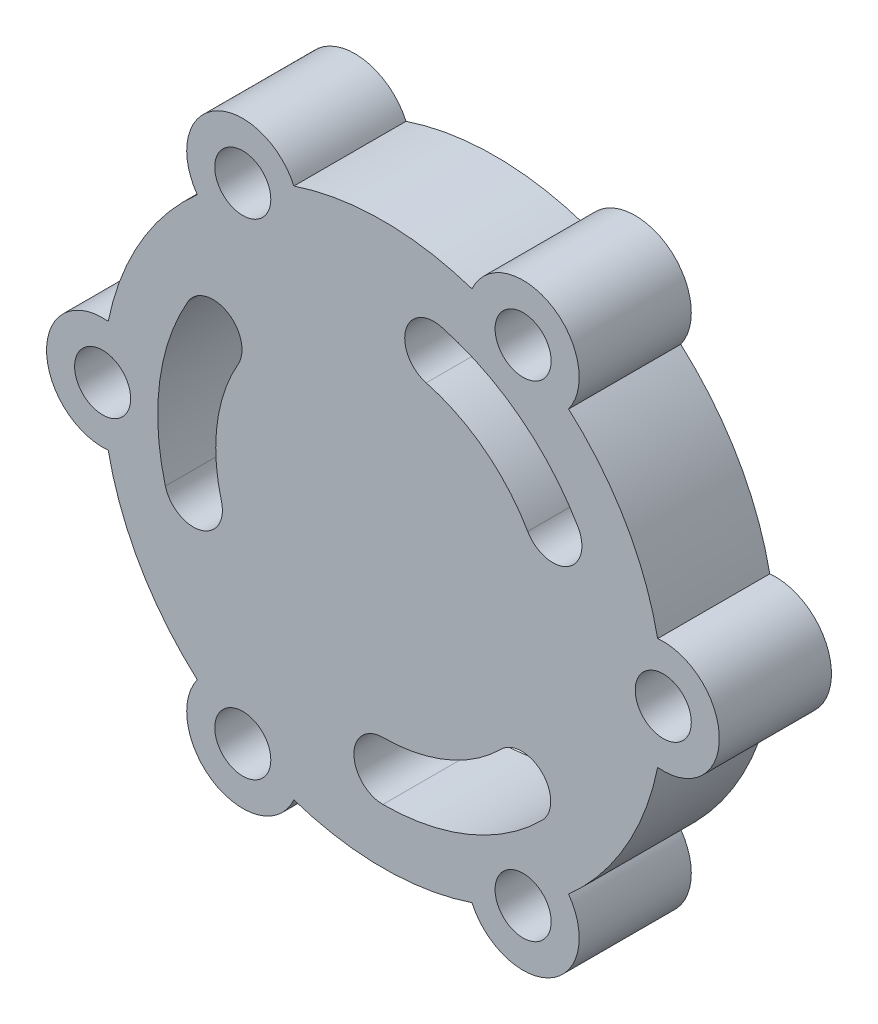
ISO-10303-21;
HEADER;
FILE_DESCRIPTION(('STEP AP214'),'2;1');
FILE_NAME('part.step','',(''),(''),'','','');
FILE_SCHEMA(('AUTOMOTIVE_DESIGN { 1 0 10303 214 1 1 1 1 }'));
ENDSEC;
DATA;
#1=APPLICATION_CONTEXT('core data for automotive mechanical design processes');
#2=APPLICATION_PROTOCOL_DEFINITION('international standard','automotive_design',2000,#1);
#3=PRODUCT_CONTEXT('',#1,'mechanical');
#4=PRODUCT('Part','Part','',(#3));
#5=PRODUCT_RELATED_PRODUCT_CATEGORY('part','',(#4));
#6=PRODUCT_DEFINITION_FORMATION('','',#4);
#7=PRODUCT_DEFINITION_CONTEXT('part definition',#1,'design');
#8=PRODUCT_DEFINITION('design','',#6,#7);
#9=PRODUCT_DEFINITION_SHAPE('','',#8);
#10=(LENGTH_UNIT() NAMED_UNIT(*) SI_UNIT(.MILLI.,.METRE.));
#11=(NAMED_UNIT(*) PLANE_ANGLE_UNIT() SI_UNIT($,.RADIAN.));
#12=(NAMED_UNIT(*) SI_UNIT($,.STERADIAN.) SOLID_ANGLE_UNIT());
#13=UNCERTAINTY_MEASURE_WITH_UNIT(LENGTH_MEASURE(1.E-05),#10,'distance_accuracy_value','');
#14=(GEOMETRIC_REPRESENTATION_CONTEXT(3) GLOBAL_UNCERTAINTY_ASSIGNED_CONTEXT((#13)) GLOBAL_UNIT_ASSIGNED_CONTEXT((#10,
#11,#12)) REPRESENTATION_CONTEXT('',''));
#15=CARTESIAN_POINT('',(0.,0.,0.));
#16=DIRECTION('',(0.,0.,1.));
#17=DIRECTION('',(1.,0.,0.));
#18=AXIS2_PLACEMENT_3D('',#15,#16,#17);
#19=CARTESIAN_POINT('',(57.5,91.650635094611,10.));
#20=DIRECTION('',(0.,0.,1.));
#21=DIRECTION('',(1.,0.,0.));
#22=AXIS2_PLACEMENT_3D('',#19,#20,#21);
#23=PLANE('',#22);
#24=CARTESIAN_POINT('',(44.9999999999999,113.301270189222,10.));
#25=DIRECTION('',(0.,0.,1.));
#26=DIRECTION('',(1.,0.,0.));
#27=AXIS2_PLACEMENT_3D('',#24,#25,#26);
#28=CIRCLE('',#27,4.99999999999999);
#29=CARTESIAN_POINT('',(49.9999999999999,113.301270189222,10.));
#30=VERTEX_POINT('',#29);
#31=EDGE_CURVE('E271',#30,#30,#28,.T.);
#32=ORIENTED_EDGE('',*,*,#31,.F.);
#33=EDGE_LOOP('',(#32));
#34=FACE_BOUND('',#33,.T.);
#35=CARTESIAN_POINT('',(45.,26.6987298107781,10.));
#36=DIRECTION('',(0.,0.,1.));
#37=DIRECTION('',(1.,0.,0.));
#38=AXIS2_PLACEMENT_3D('',#35,#36,#37);
#39=CIRCLE('',#38,5.);
#40=CARTESIAN_POINT('',(50.,26.6987298107781,10.));
#41=VERTEX_POINT('',#40);
#42=EDGE_CURVE('E283',#41,#41,#39,.T.);
#43=ORIENTED_EDGE('',*,*,#42,.F.);
#44=EDGE_LOOP('',(#43));
#45=FACE_BOUND('',#44,.T.);
#46=CARTESIAN_POINT('',(120.,70.,10.));
#47=DIRECTION('',(0.,0.,1.));
#48=DIRECTION('',(1.,0.,0.));
#49=AXIS2_PLACEMENT_3D('',#46,#47,#48);
#50=CIRCLE('',#49,5.00000000000001);
#51=CARTESIAN_POINT('',(125.,70.,10.));
#52=VERTEX_POINT('',#51);
#53=EDGE_CURVE('E326',#52,#52,#50,.T.);
#54=ORIENTED_EDGE('',*,*,#53,.F.);
#55=EDGE_LOOP('',(#54));
#56=FACE_BOUND('',#55,.T.);
#57=CARTESIAN_POINT('',(44.9999999999999,113.301270189222,10.));
#58=DIRECTION('',(0.,0.,1.));
#59=DIRECTION('',(1.,0.,0.));
#60=AXIS2_PLACEMENT_3D('',#57,#58,#59);
#61=CIRCLE('',#60,10.);
#62=CARTESIAN_POINT('',(54.116843969807,117.410181970971,10.));
#63=VERTEX_POINT('',#62);
#64=CARTESIAN_POINT('',(36.8831560301929,107.460307599904,10.));
#65=VERTEX_POINT('',#64);
#66=EDGE_CURVE('E332',#63,#65,#61,.T.);
#67=ORIENTED_EDGE('',*,*,#66,.T.);
#68=CARTESIAN_POINT('',(70.,70.,10.));
#69=DIRECTION('',(0.,0.,1.));
#70=DIRECTION('',(1.,0.,0.));
#71=AXIS2_PLACEMENT_3D('',#68,#69,#70);
#72=CIRCLE('',#71,50.);
#73=CARTESIAN_POINT('',(21.,79.9498743710662,10.));
#74=VERTEX_POINT('',#73);
#75=EDGE_CURVE('E335',#65,#74,#72,.T.);
#76=ORIENTED_EDGE('',*,*,#75,.T.);
#77=CARTESIAN_POINT('',(20.,70.,10.));
#78=DIRECTION('',(0.,0.,1.));
#79=DIRECTION('',(1.,0.,0.));
#80=AXIS2_PLACEMENT_3D('',#77,#78,#79);
#81=CIRCLE('',#80,10.);
#82=CARTESIAN_POINT('',(21.,60.0501256289338,10.));
#83=VERTEX_POINT('',#82);
#84=EDGE_CURVE('E338',#74,#83,#81,.T.);
#85=ORIENTED_EDGE('',*,*,#84,.T.);
#86=CARTESIAN_POINT('',(70.,70.,10.));
#87=DIRECTION('',(0.,0.,1.));
#88=DIRECTION('',(1.,0.,0.));
#89=AXIS2_PLACEMENT_3D('',#86,#87,#88);
#90=CIRCLE('',#89,50.);
#91=CARTESIAN_POINT('',(36.883156030193,32.5396924000956,10.));
#92=VERTEX_POINT('',#91);
#93=EDGE_CURVE('E340',#83,#92,#90,.T.);
#94=ORIENTED_EDGE('',*,*,#93,.T.);
#95=CARTESIAN_POINT('',(45.,26.6987298107781,10.));
#96=DIRECTION('',(0.,0.,1.));
#97=DIRECTION('',(1.,0.,0.));
#98=AXIS2_PLACEMENT_3D('',#95,#96,#97);
#99=CIRCLE('',#98,10.);
#100=CARTESIAN_POINT('',(54.1168439698071,22.5898180290294,10.));
#101=VERTEX_POINT('',#100);
#102=EDGE_CURVE('E342',#92,#101,#99,.T.);
#103=ORIENTED_EDGE('',*,*,#102,.T.);
#104=CARTESIAN_POINT('',(70.,70.,10.));
#105=DIRECTION('',(0.,0.,1.));
#106=DIRECTION('',(1.,0.,0.));
#107=AXIS2_PLACEMENT_3D('',#104,#105,#106);
#108=CIRCLE('',#107,50.);
#109=CARTESIAN_POINT('',(85.883156030193,22.5898180290294,10.));
#110=VERTEX_POINT('',#109);
#111=EDGE_CURVE('E344',#101,#110,#108,.T.);
#112=ORIENTED_EDGE('',*,*,#111,.T.);
#113=CARTESIAN_POINT('',(95.,26.698729810778,10.));
#114=DIRECTION('',(0.,0.,1.));
#115=DIRECTION('',(1.,0.,0.));
#116=AXIS2_PLACEMENT_3D('',#113,#114,#115);
#117=CIRCLE('',#116,9.99999999999998);
#118=CARTESIAN_POINT('',(103.116843969807,32.5396924000956,10.));
#119=VERTEX_POINT('',#118);
#120=EDGE_CURVE('E346',#110,#119,#117,.T.);
#121=ORIENTED_EDGE('',*,*,#120,.T.);
#122=CARTESIAN_POINT('',(70.,70.,10.));
#123=DIRECTION('',(0.,0.,1.));
#124=DIRECTION('',(1.,0.,0.));
#125=AXIS2_PLACEMENT_3D('',#122,#123,#124);
#126=CIRCLE('',#125,50.);
#127=CARTESIAN_POINT('',(119.,60.0501256289338,10.));
#128=VERTEX_POINT('',#127);
#129=EDGE_CURVE('E348',#119,#128,#126,.T.);
#130=ORIENTED_EDGE('',*,*,#129,.T.);
#131=CARTESIAN_POINT('',(120.,70.,10.));
#132=DIRECTION('',(0.,0.,1.));
#133=DIRECTION('',(1.,0.,0.));
#134=AXIS2_PLACEMENT_3D('',#131,#132,#133);
#135=CIRCLE('',#134,10.);
#136=CARTESIAN_POINT('',(119.,79.9498743710662,10.));
#137=VERTEX_POINT('',#136);
#138=EDGE_CURVE('E350',#128,#137,#135,.T.);
#139=ORIENTED_EDGE('',*,*,#138,.T.);
#140=CARTESIAN_POINT('',(70.,70.,10.));
#141=DIRECTION('',(0.,0.,1.));
#142=DIRECTION('',(1.,0.,0.));
#143=AXIS2_PLACEMENT_3D('',#140,#141,#142);
#144=CIRCLE('',#143,50.);
#145=CARTESIAN_POINT('',(103.116843969807,107.460307599904,10.));
#146=VERTEX_POINT('',#145);
#147=EDGE_CURVE('E352',#137,#146,#144,.T.);
#148=ORIENTED_EDGE('',*,*,#147,.T.);
#149=CARTESIAN_POINT('',(95.,113.301270189222,10.));
#150=DIRECTION('',(0.,0.,1.));
#151=DIRECTION('',(1.,0.,0.));
#152=AXIS2_PLACEMENT_3D('',#149,#150,#151);
#153=CIRCLE('',#152,10.);
#154=CARTESIAN_POINT('',(85.8831560301929,117.410181970971,10.));
#155=VERTEX_POINT('',#154);
#156=EDGE_CURVE('E354',#146,#155,#153,.T.);
#157=ORIENTED_EDGE('',*,*,#156,.T.);
#158=CARTESIAN_POINT('',(70.,70.,10.));
#159=DIRECTION('',(0.,0.,1.));
#160=DIRECTION('',(1.,0.,0.));
#161=AXIS2_PLACEMENT_3D('',#158,#159,#160);
#162=CIRCLE('',#161,50.);
#163=EDGE_CURVE('E356',#155,#63,#162,.T.);
#164=ORIENTED_EDGE('',*,*,#163,.T.);
#165=EDGE_LOOP('',(#67,#76,#85,#94,#103,#112,#121,#130,#139,#148,#157,#164));
#166=FACE_BOUND('',#165,.T.);
#167=CARTESIAN_POINT('',(95.,26.698729810778,10.));
#168=DIRECTION('',(0.,0.,1.));
#169=DIRECTION('',(1.,0.,0.));
#170=AXIS2_PLACEMENT_3D('',#167,#168,#169);
#171=CIRCLE('',#170,4.99999999999999);
#172=CARTESIAN_POINT('',(100.,26.698729810778,10.));
#173=VERTEX_POINT('',#172);
#174=EDGE_CURVE('E320',#173,#173,#171,.T.);
#175=ORIENTED_EDGE('',*,*,#174,.F.);
#176=EDGE_LOOP('',(#175));
#177=FACE_BOUND('',#176,.T.);
#178=CARTESIAN_POINT('',(70.,70.,10.));
#179=DIRECTION('',(0.,0.,1.));
#180=DIRECTION('',(1.,0.,0.));
#181=AXIS2_PLACEMENT_3D('',#178,#179,#180);
#182=CIRCLE('',#181,40.1763809020504);
#183=CARTESIAN_POINT('',(104.793766493296,90.0881904510252,10.));
#184=VERTEX_POINT('',#183);
#185=CARTESIAN_POINT('',(80.3984125407437,108.807403920117,10.));
#186=VERTEX_POINT('',#185);
#187=EDGE_CURVE('E291',#184,#186,#182,.T.);
#188=ORIENTED_EDGE('',*,*,#187,.F.);
#189=CARTESIAN_POINT('',(100.310889132455,87.5,10.));
#190=DIRECTION('',(0.,0.,1.));
#191=DIRECTION('',(1.,0.,0.));
#192=AXIS2_PLACEMENT_3D('',#189,#190,#191);
#193=CIRCLE('',#192,5.17638090205042);
#194=CARTESIAN_POINT('',(95.8280117716151,84.9118095489748,10.));
#195=VERTEX_POINT('',#194);
#196=EDGE_CURVE('E289',#195,#184,#193,.T.);
#197=ORIENTED_EDGE('',*,*,#196,.F.);
#198=CARTESIAN_POINT('',(70.,70.,10.));
#199=DIRECTION('',(0.,0.,-1.));
#200=DIRECTION('',(1.,0.,0.));
#201=AXIS2_PLACEMENT_3D('',#198,#199,#200);
#202=CIRCLE('',#201,29.8236190979496);
#203=CARTESIAN_POINT('',(77.7189206164325,98.8074039201174,10.));
#204=VERTEX_POINT('',#203);
#205=EDGE_CURVE('E297',#204,#195,#202,.T.);
#206=ORIENTED_EDGE('',*,*,#205,.F.);
#207=CARTESIAN_POINT('',(79.0586665785881,103.807403920117,10.));
#208=DIRECTION('',(0.,0.,1.));
#209=DIRECTION('',(1.,0.,0.));
#210=AXIS2_PLACEMENT_3D('',#207,#208,#209);
#211=CIRCLE('',#210,5.17638090205042);
#212=EDGE_CURVE('E294',#186,#204,#211,.T.);
#213=ORIENTED_EDGE('',*,*,#212,.F.);
#214=EDGE_LOOP('',(#188,#197,#206,#213));
#215=FACE_BOUND('',#214,.T.);
#216=CARTESIAN_POINT('',(20.,70.,10.));
#217=DIRECTION('',(0.,0.,1.));
#218=DIRECTION('',(1.,0.,0.));
#219=AXIS2_PLACEMENT_3D('',#216,#217,#218);
#220=CIRCLE('',#219,5.00000000000001);
#221=CARTESIAN_POINT('',(25.,70.,10.));
#222=VERTEX_POINT('',#221);
#223=EDGE_CURVE('E277',#222,#222,#220,.T.);
#224=ORIENTED_EDGE('',*,*,#223,.F.);
#225=EDGE_LOOP('',(#224));
#226=FACE_BOUND('',#225,.T.);
#227=CARTESIAN_POINT('',(95.,113.301270189222,10.));
#228=DIRECTION('',(0.,0.,1.));
#229=DIRECTION('',(1.,0.,0.));
#230=AXIS2_PLACEMENT_3D('',#227,#228,#229);
#231=CIRCLE('',#230,5.00000000000001);
#232=CARTESIAN_POINT('',(100.,113.301270189222,10.));
#233=VERTEX_POINT('',#232);
#234=EDGE_CURVE('E265',#233,#233,#231,.T.);
#235=ORIENTED_EDGE('',*,*,#234,.F.);
#236=EDGE_LOOP('',(#235));
#237=FACE_BOUND('',#236,.T.);
#238=CARTESIAN_POINT('',(70.0000000000002,70.,10.));
#239=DIRECTION('',(0.,0.,1.));
#240=DIRECTION('',(1.,0.,0.));
#241=AXIS2_PLACEMENT_3D('',#238,#239,#240);
#242=CIRCLE('',#241,40.1763809020504);
#243=CARTESIAN_POINT('',(70.0000000000004,29.8236190979495,10.));
#244=VERTEX_POINT('',#243);
#245=CARTESIAN_POINT('',(98.4089913793739,41.5910086206265,10.));
#246=VERTEX_POINT('',#245);
#247=EDGE_CURVE('E236',#244,#246,#242,.T.);
#248=ORIENTED_EDGE('',*,*,#247,.F.);
#249=CARTESIAN_POINT('',(70.0000000000003,35.,10.));
#250=DIRECTION('',(0.,0.,1.));
#251=DIRECTION('',(1.,0.,0.));
#252=AXIS2_PLACEMENT_3D('',#249,#250,#251);
#253=CIRCLE('',#252,5.17638090205042);
#254=CARTESIAN_POINT('',(70.0000000000003,40.1763809020504,10.));
#255=VERTEX_POINT('',#254);
#256=EDGE_CURVE('E234',#255,#244,#253,.T.);
#257=ORIENTED_EDGE('',*,*,#256,.F.);
#258=CARTESIAN_POINT('',(70.0000000000002,70.,10.));
#259=DIRECTION('',(0.,0.,-1.));
#260=DIRECTION('',(1.,0.,0.));
#261=AXIS2_PLACEMENT_3D('',#258,#259,#260);
#262=CIRCLE('',#261,29.8236190979496);
#263=CARTESIAN_POINT('',(91.0884833036851,48.9115166963153,10.));
#264=VERTEX_POINT('',#263);
#265=EDGE_CURVE('E242',#264,#255,#262,.T.);
#266=ORIENTED_EDGE('',*,*,#265,.F.);
#267=CARTESIAN_POINT('',(94.7487373415295,45.2512626584709,10.));
#268=DIRECTION('',(0.,0.,1.));
#269=DIRECTION('',(1.,0.,0.));
#270=AXIS2_PLACEMENT_3D('',#267,#268,#269);
#271=CIRCLE('',#270,5.17638090205042);
#272=EDGE_CURVE('E239',#246,#264,#271,.T.);
#273=ORIENTED_EDGE('',*,*,#272,.F.);
#274=EDGE_LOOP('',(#248,#257,#266,#273));
#275=FACE_BOUND('',#274,.T.);
#276=CARTESIAN_POINT('',(69.9999999999998,69.9999999999998,10.));
#277=DIRECTION('',(0.,0.,1.));
#278=DIRECTION('',(1.,0.,0.));
#279=AXIS2_PLACEMENT_3D('',#276,#277,#278);
#280=CIRCLE('',#279,40.1763809020504);
#281=CARTESIAN_POINT('',(35.2062335067041,90.088190451025,10.));
#282=VERTEX_POINT('',#281);
#283=CARTESIAN_POINT('',(31.1925960798824,59.6015874592559,10.));
#284=VERTEX_POINT('',#283);
#285=EDGE_CURVE('E206',#282,#284,#280,.T.);
#286=ORIENTED_EDGE('',*,*,#285,.F.);
#287=CARTESIAN_POINT('',(39.6891108675444,87.4999999999997,10.));
#288=DIRECTION('',(0.,0.,1.));
#289=DIRECTION('',(1.,0.,0.));
#290=AXIS2_PLACEMENT_3D('',#287,#288,#289);
#291=CIRCLE('',#290,5.17638090205044);
#292=CARTESIAN_POINT('',(44.1719882283847,84.9118095489745,10.));
#293=VERTEX_POINT('',#292);
#294=EDGE_CURVE('E198',#293,#282,#291,.T.);
#295=ORIENTED_EDGE('',*,*,#294,.F.);
#296=CARTESIAN_POINT('',(69.9999999999998,69.9999999999998,10.));
#297=DIRECTION('',(0.,0.,-1.));
#298=DIRECTION('',(1.,0.,0.));
#299=AXIS2_PLACEMENT_3D('',#296,#297,#298);
#300=CIRCLE('',#299,29.8236190979496);
#301=CARTESIAN_POINT('',(41.1925960798825,62.2810793835671,10.));
#302=VERTEX_POINT('',#301);
#303=EDGE_CURVE('E220',#302,#293,#300,.T.);
#304=ORIENTED_EDGE('',*,*,#303,.F.);
#305=CARTESIAN_POINT('',(36.1925960798825,60.9413334214115,10.));
#306=DIRECTION('',(0.,0.,1.));
#307=DIRECTION('',(1.,0.,0.));
#308=AXIS2_PLACEMENT_3D('',#305,#306,#307);
#309=CIRCLE('',#308,5.17638090205044);
#310=EDGE_CURVE('E218',#284,#302,#309,.T.);
#311=ORIENTED_EDGE('',*,*,#310,.F.);
#312=EDGE_LOOP('',(#286,#295,#304,#311));
#313=FACE_BOUND('',#312,.T.);
#314=ADVANCED_FACE('F37',(#34,#45,#56,#166,#177,#215,#226,#237,#275,#313),#23,.T.);
#315=CARTESIAN_POINT('',(57.5,91.650635094611,-10.));
#316=DIRECTION('',(0.,0.,1.));
#317=DIRECTION('',(1.,0.,0.));
#318=AXIS2_PLACEMENT_3D('',#315,#316,#317);
#319=PLANE('',#318);
#320=CARTESIAN_POINT('',(70.0000000000003,35.,-10.));
#321=DIRECTION('',(0.,0.,1.));
#322=DIRECTION('',(1.,0.,0.));
#323=AXIS2_PLACEMENT_3D('',#320,#321,#322);
#324=CIRCLE('',#323,5.17638090205042);
#325=CARTESIAN_POINT('',(70.0000000000003,40.1763809020504,-10.));
#326=VERTEX_POINT('',#325);
#327=CARTESIAN_POINT('',(70.0000000000004,29.8236190979495,-10.));
#328=VERTEX_POINT('',#327);
#329=EDGE_CURVE('E214',#326,#328,#324,.T.);
#330=ORIENTED_EDGE('',*,*,#329,.T.);
#331=CARTESIAN_POINT('',(70.0000000000002,70.,-10.));
#332=DIRECTION('',(0.,0.,1.));
#333=DIRECTION('',(1.,0.,0.));
#334=AXIS2_PLACEMENT_3D('',#331,#332,#333);
#335=CIRCLE('',#334,40.1763809020504);
#336=CARTESIAN_POINT('',(98.4089913793739,41.5910086206265,-10.));
#337=VERTEX_POINT('',#336);
#338=EDGE_CURVE('E247',#328,#337,#335,.T.);
#339=ORIENTED_EDGE('',*,*,#338,.T.);
#340=CARTESIAN_POINT('',(94.7487373415295,45.2512626584709,-10.));
#341=DIRECTION('',(0.,0.,1.));
#342=DIRECTION('',(1.,0.,0.));
#343=AXIS2_PLACEMENT_3D('',#340,#341,#342);
#344=CIRCLE('',#343,5.17638090205042);
#345=CARTESIAN_POINT('',(91.0884833036851,48.9115166963153,-10.));
#346=VERTEX_POINT('',#345);
#347=EDGE_CURVE('E250',#337,#346,#344,.T.);
#348=ORIENTED_EDGE('',*,*,#347,.T.);
#349=CARTESIAN_POINT('',(70.0000000000002,70.,-10.));
#350=DIRECTION('',(0.,0.,-1.));
#351=DIRECTION('',(1.,0.,0.));
#352=AXIS2_PLACEMENT_3D('',#349,#350,#351);
#353=CIRCLE('',#352,29.8236190979496);
#354=EDGE_CURVE('E237',#346,#326,#353,.T.);
#355=ORIENTED_EDGE('',*,*,#354,.T.);
#356=EDGE_LOOP('',(#330,#339,#348,#355));
#357=FACE_BOUND('',#356,.T.);
#358=CARTESIAN_POINT('',(95.,26.698729810778,-10.));
#359=DIRECTION('',(0.,0.,1.));
#360=DIRECTION('',(1.,0.,0.));
#361=AXIS2_PLACEMENT_3D('',#358,#359,#360);
#362=CIRCLE('',#361,4.99999999999999);
#363=CARTESIAN_POINT('',(100.,26.698729810778,-10.));
#364=VERTEX_POINT('',#363);
#365=EDGE_CURVE('E319',#364,#364,#362,.T.);
#366=ORIENTED_EDGE('',*,*,#365,.T.);
#367=EDGE_LOOP('',(#366));
#368=FACE_BOUND('',#367,.T.);
#369=CARTESIAN_POINT('',(120.,70.,-10.));
#370=DIRECTION('',(0.,0.,1.));
#371=DIRECTION('',(1.,0.,0.));
#372=AXIS2_PLACEMENT_3D('',#369,#370,#371);
#373=CIRCLE('',#372,5.00000000000001);
#374=CARTESIAN_POINT('',(125.,70.,-10.));
#375=VERTEX_POINT('',#374);
#376=EDGE_CURVE('E323',#375,#375,#373,.T.);
#377=ORIENTED_EDGE('',*,*,#376,.T.);
#378=EDGE_LOOP('',(#377));
#379=FACE_BOUND('',#378,.T.);
#380=CARTESIAN_POINT('',(44.9999999999999,113.301270189222,-10.));
#381=DIRECTION('',(0.,0.,1.));
#382=DIRECTION('',(1.,0.,0.));
#383=AXIS2_PLACEMENT_3D('',#380,#381,#382);
#384=CIRCLE('',#383,10.);
#385=CARTESIAN_POINT('',(54.116843969807,117.410181970971,-10.));
#386=VERTEX_POINT('',#385);
#387=CARTESIAN_POINT('',(36.8831560301929,107.460307599904,-10.));
#388=VERTEX_POINT('',#387);
#389=EDGE_CURVE('E329',#386,#388,#384,.T.);
#390=ORIENTED_EDGE('',*,*,#389,.F.);
#391=CARTESIAN_POINT('',(70.,70.,-10.));
#392=DIRECTION('',(0.,0.,1.));
#393=DIRECTION('',(1.,0.,0.));
#394=AXIS2_PLACEMENT_3D('',#391,#392,#393);
#395=CIRCLE('',#394,50.);
#396=CARTESIAN_POINT('',(85.8831560301929,117.410181970971,-10.));
#397=VERTEX_POINT('',#396);
#398=EDGE_CURVE('E336',#397,#386,#395,.T.);
#399=ORIENTED_EDGE('',*,*,#398,.F.);
#400=CARTESIAN_POINT('',(95.,113.301270189222,-10.));
#401=DIRECTION('',(0.,0.,1.));
#402=DIRECTION('',(1.,0.,0.));
#403=AXIS2_PLACEMENT_3D('',#400,#401,#402);
#404=CIRCLE('',#403,10.);
#405=CARTESIAN_POINT('',(103.116843969807,107.460307599904,-10.));
#406=VERTEX_POINT('',#405);
#407=EDGE_CURVE('E379',#406,#397,#404,.T.);
#408=ORIENTED_EDGE('',*,*,#407,.F.);
#409=CARTESIAN_POINT('',(70.,70.,-10.));
#410=DIRECTION('',(0.,0.,1.));
#411=DIRECTION('',(1.,0.,0.));
#412=AXIS2_PLACEMENT_3D('',#409,#410,#411);
#413=CIRCLE('',#412,50.);
#414=CARTESIAN_POINT('',(119.,79.9498743710662,-10.));
#415=VERTEX_POINT('',#414);
#416=EDGE_CURVE('E377',#415,#406,#413,.T.);
#417=ORIENTED_EDGE('',*,*,#416,.F.);
#418=CARTESIAN_POINT('',(120.,70.,-10.));
#419=DIRECTION('',(0.,0.,1.));
#420=DIRECTION('',(1.,0.,0.));
#421=AXIS2_PLACEMENT_3D('',#418,#419,#420);
#422=CIRCLE('',#421,10.);
#423=CARTESIAN_POINT('',(119.,60.0501256289338,-10.));
#424=VERTEX_POINT('',#423);
#425=EDGE_CURVE('E375',#424,#415,#422,.T.);
#426=ORIENTED_EDGE('',*,*,#425,.F.);
#427=CARTESIAN_POINT('',(70.,70.,-10.));
#428=DIRECTION('',(0.,0.,1.));
#429=DIRECTION('',(1.,0.,0.));
#430=AXIS2_PLACEMENT_3D('',#427,#428,#429);
#431=CIRCLE('',#430,50.);
#432=CARTESIAN_POINT('',(103.116843969807,32.5396924000956,-10.));
#433=VERTEX_POINT('',#432);
#434=EDGE_CURVE('E373',#433,#424,#431,.T.);
#435=ORIENTED_EDGE('',*,*,#434,.F.);
#436=CARTESIAN_POINT('',(95.,26.698729810778,-10.));
#437=DIRECTION('',(0.,0.,1.));
#438=DIRECTION('',(1.,0.,0.));
#439=AXIS2_PLACEMENT_3D('',#436,#437,#438);
#440=CIRCLE('',#439,9.99999999999998);
#441=CARTESIAN_POINT('',(85.883156030193,22.5898180290294,-10.));
#442=VERTEX_POINT('',#441);
#443=EDGE_CURVE('E371',#442,#433,#440,.T.);
#444=ORIENTED_EDGE('',*,*,#443,.F.);
#445=CARTESIAN_POINT('',(70.,70.,-10.));
#446=DIRECTION('',(0.,0.,1.));
#447=DIRECTION('',(1.,0.,0.));
#448=AXIS2_PLACEMENT_3D('',#445,#446,#447);
#449=CIRCLE('',#448,50.);
#450=CARTESIAN_POINT('',(54.1168439698071,22.5898180290294,-10.));
#451=VERTEX_POINT('',#450);
#452=EDGE_CURVE('E369',#451,#442,#449,.T.);
#453=ORIENTED_EDGE('',*,*,#452,.F.);
#454=CARTESIAN_POINT('',(45.,26.6987298107781,-10.));
#455=DIRECTION('',(0.,0.,1.));
#456=DIRECTION('',(1.,0.,0.));
#457=AXIS2_PLACEMENT_3D('',#454,#455,#456);
#458=CIRCLE('',#457,10.);
#459=CARTESIAN_POINT('',(36.883156030193,32.5396924000956,-10.));
#460=VERTEX_POINT('',#459);
#461=EDGE_CURVE('E367',#460,#451,#458,.T.);
#462=ORIENTED_EDGE('',*,*,#461,.F.);
#463=CARTESIAN_POINT('',(70.,70.,-10.));
#464=DIRECTION('',(0.,0.,1.));
#465=DIRECTION('',(1.,0.,0.));
#466=AXIS2_PLACEMENT_3D('',#463,#464,#465);
#467=CIRCLE('',#466,50.);
#468=CARTESIAN_POINT('',(21.,60.0501256289338,-10.));
#469=VERTEX_POINT('',#468);
#470=EDGE_CURVE('E365',#469,#460,#467,.T.);
#471=ORIENTED_EDGE('',*,*,#470,.F.);
#472=CARTESIAN_POINT('',(20.,70.,-10.));
#473=DIRECTION('',(0.,0.,1.));
#474=DIRECTION('',(1.,0.,0.));
#475=AXIS2_PLACEMENT_3D('',#472,#473,#474);
#476=CIRCLE('',#475,10.);
#477=CARTESIAN_POINT('',(21.,79.9498743710662,-10.));
#478=VERTEX_POINT('',#477);
#479=EDGE_CURVE('E363',#478,#469,#476,.T.);
#480=ORIENTED_EDGE('',*,*,#479,.F.);
#481=CARTESIAN_POINT('',(70.,70.,-10.));
#482=DIRECTION('',(0.,0.,1.));
#483=DIRECTION('',(1.,0.,0.));
#484=AXIS2_PLACEMENT_3D('',#481,#482,#483);
#485=CIRCLE('',#484,50.);
#486=EDGE_CURVE('E361',#388,#478,#485,.T.);
#487=ORIENTED_EDGE('',*,*,#486,.F.);
#488=EDGE_LOOP('',(#390,#399,#408,#417,#426,#435,#444,#453,#462,#471,#480,#487));
#489=FACE_BOUND('',#488,.T.);
#490=CARTESIAN_POINT('',(100.310889132455,87.5,-10.));
#491=DIRECTION('',(0.,0.,1.));
#492=DIRECTION('',(1.,0.,0.));
#493=AXIS2_PLACEMENT_3D('',#490,#491,#492);
#494=CIRCLE('',#493,5.17638090205042);
#495=CARTESIAN_POINT('',(95.8280117716151,84.9118095489748,-10.));
#496=VERTEX_POINT('',#495);
#497=CARTESIAN_POINT('',(104.793766493296,90.0881904510252,-10.));
#498=VERTEX_POINT('',#497);
#499=EDGE_CURVE('E286',#496,#498,#494,.T.);
#500=ORIENTED_EDGE('',*,*,#499,.T.);
#501=CARTESIAN_POINT('',(70.,70.,-10.));
#502=DIRECTION('',(0.,0.,1.));
#503=DIRECTION('',(1.,0.,0.));
#504=AXIS2_PLACEMENT_3D('',#501,#502,#503);
#505=CIRCLE('',#504,40.1763809020504);
#506=CARTESIAN_POINT('',(80.3984125407437,108.807403920117,-10.));
#507=VERTEX_POINT('',#506);
#508=EDGE_CURVE('E302',#498,#507,#505,.T.);
#509=ORIENTED_EDGE('',*,*,#508,.T.);
#510=CARTESIAN_POINT('',(79.0586665785881,103.807403920117,-10.));
#511=DIRECTION('',(0.,0.,1.));
#512=DIRECTION('',(1.,0.,0.));
#513=AXIS2_PLACEMENT_3D('',#510,#511,#512);
#514=CIRCLE('',#513,5.17638090205042);
#515=CARTESIAN_POINT('',(77.7189206164325,98.8074039201174,-10.));
#516=VERTEX_POINT('',#515);
#517=EDGE_CURVE('E305',#507,#516,#514,.T.);
#518=ORIENTED_EDGE('',*,*,#517,.T.);
#519=CARTESIAN_POINT('',(70.,70.,-10.));
#520=DIRECTION('',(0.,0.,-1.));
#521=DIRECTION('',(1.,0.,0.));
#522=AXIS2_PLACEMENT_3D('',#519,#520,#521);
#523=CIRCLE('',#522,29.8236190979496);
#524=EDGE_CURVE('E292',#516,#496,#523,.T.);
#525=ORIENTED_EDGE('',*,*,#524,.T.);
#526=EDGE_LOOP('',(#500,#509,#518,#525));
#527=FACE_BOUND('',#526,.T.);
#528=CARTESIAN_POINT('',(45.,26.6987298107781,-10.));
#529=DIRECTION('',(0.,0.,1.));
#530=DIRECTION('',(1.,0.,0.));
#531=AXIS2_PLACEMENT_3D('',#528,#529,#530);
#532=CIRCLE('',#531,5.);
#533=CARTESIAN_POINT('',(50.,26.6987298107781,-10.));
#534=VERTEX_POINT('',#533);
#535=EDGE_CURVE('E280',#534,#534,#532,.T.);
#536=ORIENTED_EDGE('',*,*,#535,.T.);
#537=EDGE_LOOP('',(#536));
#538=FACE_BOUND('',#537,.T.);
#539=CARTESIAN_POINT('',(20.,70.,-10.));
#540=DIRECTION('',(0.,0.,1.));
#541=DIRECTION('',(1.,0.,0.));
#542=AXIS2_PLACEMENT_3D('',#539,#540,#541);
#543=CIRCLE('',#542,5.00000000000001);
#544=CARTESIAN_POINT('',(25.,70.,-10.));
#545=VERTEX_POINT('',#544);
#546=EDGE_CURVE('E274',#545,#545,#543,.T.);
#547=ORIENTED_EDGE('',*,*,#546,.T.);
#548=EDGE_LOOP('',(#547));
#549=FACE_BOUND('',#548,.T.);
#550=CARTESIAN_POINT('',(44.9999999999999,113.301270189222,-10.));
#551=DIRECTION('',(0.,0.,1.));
#552=DIRECTION('',(1.,0.,0.));
#553=AXIS2_PLACEMENT_3D('',#550,#551,#552);
#554=CIRCLE('',#553,4.99999999999999);
#555=CARTESIAN_POINT('',(49.9999999999999,113.301270189222,-10.));
#556=VERTEX_POINT('',#555);
#557=EDGE_CURVE('E268',#556,#556,#554,.T.);
#558=ORIENTED_EDGE('',*,*,#557,.T.);
#559=EDGE_LOOP('',(#558));
#560=FACE_BOUND('',#559,.T.);
#561=CARTESIAN_POINT('',(95.,113.301270189222,-10.));
#562=DIRECTION('',(0.,0.,1.));
#563=DIRECTION('',(1.,0.,0.));
#564=AXIS2_PLACEMENT_3D('',#561,#562,#563);
#565=CIRCLE('',#564,5.00000000000001);
#566=CARTESIAN_POINT('',(100.,113.301270189222,-10.));
#567=VERTEX_POINT('',#566);
#568=EDGE_CURVE('E264',#567,#567,#565,.T.);
#569=ORIENTED_EDGE('',*,*,#568,.T.);
#570=EDGE_LOOP('',(#569));
#571=FACE_BOUND('',#570,.T.);
#572=CARTESIAN_POINT('',(39.6891108675444,87.4999999999997,-10.));
#573=DIRECTION('',(0.,0.,1.));
#574=DIRECTION('',(1.,0.,0.));
#575=AXIS2_PLACEMENT_3D('',#572,#573,#574);
#576=CIRCLE('',#575,5.17638090205044);
#577=CARTESIAN_POINT('',(44.1719882283847,84.9118095489745,-10.));
#578=VERTEX_POINT('',#577);
#579=CARTESIAN_POINT('',(35.2062335067041,90.088190451025,-10.));
#580=VERTEX_POINT('',#579);
#581=EDGE_CURVE('E60',#578,#580,#576,.T.);
#582=ORIENTED_EDGE('',*,*,#581,.T.);
#583=CARTESIAN_POINT('',(69.9999999999998,69.9999999999998,-10.));
#584=DIRECTION('',(0.,0.,1.));
#585=DIRECTION('',(1.,0.,0.));
#586=AXIS2_PLACEMENT_3D('',#583,#584,#585);
#587=CIRCLE('',#586,40.1763809020504);
#588=CARTESIAN_POINT('',(31.1925960798824,59.6015874592559,-10.));
#589=VERTEX_POINT('',#588);
#590=EDGE_CURVE('E213',#580,#589,#587,.T.);
#591=ORIENTED_EDGE('',*,*,#590,.T.);
#592=CARTESIAN_POINT('',(36.1925960798825,60.9413334214115,-10.));
#593=DIRECTION('',(0.,0.,1.));
#594=DIRECTION('',(1.,0.,0.));
#595=AXIS2_PLACEMENT_3D('',#592,#593,#594);
#596=CIRCLE('',#595,5.17638090205044);
#597=CARTESIAN_POINT('',(41.1925960798825,62.2810793835671,-10.));
#598=VERTEX_POINT('',#597);
#599=EDGE_CURVE('E226',#589,#598,#596,.T.);
#600=ORIENTED_EDGE('',*,*,#599,.T.);
#601=CARTESIAN_POINT('',(69.9999999999998,69.9999999999998,-10.));
#602=DIRECTION('',(0.,0.,-1.));
#603=DIRECTION('',(1.,0.,0.));
#604=AXIS2_PLACEMENT_3D('',#601,#602,#603);
#605=CIRCLE('',#604,29.8236190979496);
#606=EDGE_CURVE('E207',#598,#578,#605,.T.);
#607=ORIENTED_EDGE('',*,*,#606,.T.);
#608=EDGE_LOOP('',(#582,#591,#600,#607));
#609=FACE_BOUND('',#608,.T.);
#610=ADVANCED_FACE('F421',(#357,#368,#379,#489,#527,#538,#549,#560,#571,#609),#319,.F.);
#611=CARTESIAN_POINT('',(44.9999999999999,113.301270189222,10.));
#612=DIRECTION('',(0.,0.,-1.));
#613=DIRECTION('',(-1.,0.,0.));
#614=AXIS2_PLACEMENT_3D('',#611,#612,#613);
#615=CYLINDRICAL_SURFACE('',#614,10.);
#616=ORIENTED_EDGE('',*,*,#389,.T.);
#617=DIRECTION('',(0.,0.,-1.));
#618=VECTOR('',#617,1.);
#619=CARTESIAN_POINT('',(36.8831560301929,107.460307599904,10.));
#620=LINE('',#619,#618);
#621=EDGE_CURVE('E11',#65,#388,#620,.T.);
#622=ORIENTED_EDGE('',*,*,#621,.F.);
#623=ORIENTED_EDGE('',*,*,#66,.F.);
#624=DIRECTION('',(0.,0.,-1.));
#625=VECTOR('',#624,1.);
#626=CARTESIAN_POINT('',(54.116843969807,117.410181970971,10.));
#627=LINE('',#626,#625);
#628=EDGE_CURVE('E358',#63,#386,#627,.T.);
#629=ORIENTED_EDGE('',*,*,#628,.T.);
#630=EDGE_LOOP('',(#616,#622,#623,#629));
#631=FACE_BOUND('',#630,.T.);
#632=ADVANCED_FACE('F39',(#631),#615,.T.);
#633=CARTESIAN_POINT('',(70.,70.,10.));
#634=DIRECTION('',(0.,0.,-1.));
#635=DIRECTION('',(-1.,0.,0.));
#636=AXIS2_PLACEMENT_3D('',#633,#634,#635);
#637=CYLINDRICAL_SURFACE('',#636,50.);
#638=ORIENTED_EDGE('',*,*,#486,.T.);
#639=DIRECTION('',(0.,0.,-1.));
#640=VECTOR('',#639,1.);
#641=CARTESIAN_POINT('',(21.,79.9498743710662,10.));
#642=LINE('',#641,#640);
#643=EDGE_CURVE('E45',#74,#478,#642,.T.);
#644=ORIENTED_EDGE('',*,*,#643,.F.);
#645=ORIENTED_EDGE('',*,*,#75,.F.);
#646=ORIENTED_EDGE('',*,*,#621,.T.);
#647=EDGE_LOOP('',(#638,#644,#645,#646));
#648=FACE_BOUND('',#647,.T.);
#649=ADVANCED_FACE('F439',(#648),#637,.T.);
#650=CARTESIAN_POINT('',(20.,70.,10.));
#651=DIRECTION('',(0.,0.,-1.));
#652=DIRECTION('',(-1.,0.,0.));
#653=AXIS2_PLACEMENT_3D('',#650,#651,#652);
#654=CYLINDRICAL_SURFACE('',#653,10.);
#655=ORIENTED_EDGE('',*,*,#479,.T.);
#656=DIRECTION('',(0.,0.,-1.));
#657=VECTOR('',#656,1.);
#658=CARTESIAN_POINT('',(21.,60.0501256289338,10.));
#659=LINE('',#658,#657);
#660=EDGE_CURVE('E408',#83,#469,#659,.T.);
#661=ORIENTED_EDGE('',*,*,#660,.F.);
#662=ORIENTED_EDGE('',*,*,#84,.F.);
#663=ORIENTED_EDGE('',*,*,#643,.T.);
#664=EDGE_LOOP('',(#655,#661,#662,#663));
#665=FACE_BOUND('',#664,.T.);
#666=ADVANCED_FACE('F415',(#665),#654,.T.);
#667=CARTESIAN_POINT('',(70.,70.,10.));
#668=DIRECTION('',(0.,0.,-1.));
#669=DIRECTION('',(-1.,0.,0.));
#670=AXIS2_PLACEMENT_3D('',#667,#668,#669);
#671=CYLINDRICAL_SURFACE('',#670,50.);
#672=ORIENTED_EDGE('',*,*,#470,.T.);
#673=DIRECTION('',(0.,0.,-1.));
#674=VECTOR('',#673,1.);
#675=CARTESIAN_POINT('',(36.883156030193,32.5396924000956,10.));
#676=LINE('',#675,#674);
#677=EDGE_CURVE('E405',#92,#460,#676,.T.);
#678=ORIENTED_EDGE('',*,*,#677,.F.);
#679=ORIENTED_EDGE('',*,*,#93,.F.);
#680=ORIENTED_EDGE('',*,*,#660,.T.);
#681=EDGE_LOOP('',(#672,#678,#679,#680));
#682=FACE_BOUND('',#681,.T.);
#683=ADVANCED_FACE('F427',(#682),#671,.T.);
#684=CARTESIAN_POINT('',(45.,26.6987298107781,10.));
#685=DIRECTION('',(0.,0.,-1.));
#686=DIRECTION('',(-1.,0.,0.));
#687=AXIS2_PLACEMENT_3D('',#684,#685,#686);
#688=CYLINDRICAL_SURFACE('',#687,10.);
#689=ORIENTED_EDGE('',*,*,#461,.T.);
#690=DIRECTION('',(0.,0.,-1.));
#691=VECTOR('',#690,1.);
#692=CARTESIAN_POINT('',(54.1168439698071,22.5898180290294,10.));
#693=LINE('',#692,#691);
#694=EDGE_CURVE('E402',#101,#451,#693,.T.);
#695=ORIENTED_EDGE('',*,*,#694,.F.);
#696=ORIENTED_EDGE('',*,*,#102,.F.);
#697=ORIENTED_EDGE('',*,*,#677,.T.);
#698=EDGE_LOOP('',(#689,#695,#696,#697));
#699=FACE_BOUND('',#698,.T.);
#700=ADVANCED_FACE('F431',(#699),#688,.T.);
#701=CARTESIAN_POINT('',(70.,70.,10.));
#702=DIRECTION('',(0.,0.,-1.));
#703=DIRECTION('',(-1.,0.,0.));
#704=AXIS2_PLACEMENT_3D('',#701,#702,#703);
#705=CYLINDRICAL_SURFACE('',#704,50.);
#706=ORIENTED_EDGE('',*,*,#452,.T.);
#707=DIRECTION('',(0.,0.,-1.));
#708=VECTOR('',#707,1.);
#709=CARTESIAN_POINT('',(85.883156030193,22.5898180290294,10.));
#710=LINE('',#709,#708);
#711=EDGE_CURVE('E399',#110,#442,#710,.T.);
#712=ORIENTED_EDGE('',*,*,#711,.F.);
#713=ORIENTED_EDGE('',*,*,#111,.F.);
#714=ORIENTED_EDGE('',*,*,#694,.T.);
#715=EDGE_LOOP('',(#706,#712,#713,#714));
#716=FACE_BOUND('',#715,.T.);
#717=ADVANCED_FACE('F472',(#716),#705,.T.);
#718=CARTESIAN_POINT('',(95.,26.698729810778,10.));
#719=DIRECTION('',(0.,0.,-1.));
#720=DIRECTION('',(-1.,0.,0.));
#721=AXIS2_PLACEMENT_3D('',#718,#719,#720);
#722=CYLINDRICAL_SURFACE('',#721,9.99999999999998);
#723=ORIENTED_EDGE('',*,*,#443,.T.);
#724=DIRECTION('',(0.,0.,-1.));
#725=VECTOR('',#724,1.);
#726=CARTESIAN_POINT('',(103.116843969807,32.5396924000956,10.));
#727=LINE('',#726,#725);
#728=EDGE_CURVE('E396',#119,#433,#727,.T.);
#729=ORIENTED_EDGE('',*,*,#728,.F.);
#730=ORIENTED_EDGE('',*,*,#120,.F.);
#731=ORIENTED_EDGE('',*,*,#711,.T.);
#732=EDGE_LOOP('',(#723,#729,#730,#731));
#733=FACE_BOUND('',#732,.T.);
#734=ADVANCED_FACE('F470',(#733),#722,.T.);
#735=CARTESIAN_POINT('',(70.,70.,10.));
#736=DIRECTION('',(0.,0.,-1.));
#737=DIRECTION('',(-1.,0.,0.));
#738=AXIS2_PLACEMENT_3D('',#735,#736,#737);
#739=CYLINDRICAL_SURFACE('',#738,50.);
#740=ORIENTED_EDGE('',*,*,#434,.T.);
#741=DIRECTION('',(0.,0.,-1.));
#742=VECTOR('',#741,1.);
#743=CARTESIAN_POINT('',(119.,60.0501256289338,10.));
#744=LINE('',#743,#742);
#745=EDGE_CURVE('E393',#128,#424,#744,.T.);
#746=ORIENTED_EDGE('',*,*,#745,.F.);
#747=ORIENTED_EDGE('',*,*,#129,.F.);
#748=ORIENTED_EDGE('',*,*,#728,.T.);
#749=EDGE_LOOP('',(#740,#746,#747,#748));
#750=FACE_BOUND('',#749,.T.);
#751=ADVANCED_FACE('F466',(#750),#739,.T.);
#752=CARTESIAN_POINT('',(120.,70.,10.));
#753=DIRECTION('',(0.,0.,-1.));
#754=DIRECTION('',(-1.,0.,0.));
#755=AXIS2_PLACEMENT_3D('',#752,#753,#754);
#756=CYLINDRICAL_SURFACE('',#755,10.);
#757=ORIENTED_EDGE('',*,*,#425,.T.);
#758=DIRECTION('',(0.,0.,-1.));
#759=VECTOR('',#758,1.);
#760=CARTESIAN_POINT('',(119.,79.9498743710662,10.));
#761=LINE('',#760,#759);
#762=EDGE_CURVE('E390',#137,#415,#761,.T.);
#763=ORIENTED_EDGE('',*,*,#762,.F.);
#764=ORIENTED_EDGE('',*,*,#138,.F.);
#765=ORIENTED_EDGE('',*,*,#745,.T.);
#766=EDGE_LOOP('',(#757,#763,#764,#765));
#767=FACE_BOUND('',#766,.T.);
#768=ADVANCED_FACE('F461',(#767),#756,.T.);
#769=CARTESIAN_POINT('',(70.,70.,10.));
#770=DIRECTION('',(0.,0.,-1.));
#771=DIRECTION('',(-1.,0.,0.));
#772=AXIS2_PLACEMENT_3D('',#769,#770,#771);
#773=CYLINDRICAL_SURFACE('',#772,50.);
#774=ORIENTED_EDGE('',*,*,#416,.T.);
#775=DIRECTION('',(0.,0.,-1.));
#776=VECTOR('',#775,1.);
#777=CARTESIAN_POINT('',(103.116843969807,107.460307599904,10.));
#778=LINE('',#777,#776);
#779=EDGE_CURVE('E387',#146,#406,#778,.T.);
#780=ORIENTED_EDGE('',*,*,#779,.F.);
#781=ORIENTED_EDGE('',*,*,#147,.F.);
#782=ORIENTED_EDGE('',*,*,#762,.T.);
#783=EDGE_LOOP('',(#774,#780,#781,#782));
#784=FACE_BOUND('',#783,.T.);
#785=ADVANCED_FACE('F455',(#784),#773,.T.);
#786=CARTESIAN_POINT('',(95.,113.301270189222,10.));
#787=DIRECTION('',(0.,0.,-1.));
#788=DIRECTION('',(-1.,0.,0.));
#789=AXIS2_PLACEMENT_3D('',#786,#787,#788);
#790=CYLINDRICAL_SURFACE('',#789,10.);
#791=ORIENTED_EDGE('',*,*,#407,.T.);
#792=DIRECTION('',(0.,0.,-1.));
#793=VECTOR('',#792,1.);
#794=CARTESIAN_POINT('',(85.8831560301929,117.410181970971,10.));
#795=LINE('',#794,#793);
#796=EDGE_CURVE('E384',#155,#397,#795,.T.);
#797=ORIENTED_EDGE('',*,*,#796,.F.);
#798=ORIENTED_EDGE('',*,*,#156,.F.);
#799=ORIENTED_EDGE('',*,*,#779,.T.);
#800=EDGE_LOOP('',(#791,#797,#798,#799));
#801=FACE_BOUND('',#800,.T.);
#802=ADVANCED_FACE('F451',(#801),#790,.T.);
#803=CARTESIAN_POINT('',(70.,70.,10.));
#804=DIRECTION('',(0.,0.,-1.));
#805=DIRECTION('',(-1.,0.,0.));
#806=AXIS2_PLACEMENT_3D('',#803,#804,#805);
#807=CYLINDRICAL_SURFACE('',#806,50.);
#808=ORIENTED_EDGE('',*,*,#398,.T.);
#809=ORIENTED_EDGE('',*,*,#628,.F.);
#810=ORIENTED_EDGE('',*,*,#163,.F.);
#811=ORIENTED_EDGE('',*,*,#796,.T.);
#812=EDGE_LOOP('',(#808,#809,#810,#811));
#813=FACE_BOUND('',#812,.T.);
#814=ADVANCED_FACE('F446',(#813),#807,.T.);
#815=CARTESIAN_POINT('',(120.,70.,10.));
#816=DIRECTION('',(0.,0.,-1.));
#817=DIRECTION('',(-1.,0.,0.));
#818=AXIS2_PLACEMENT_3D('',#815,#816,#817);
#819=CYLINDRICAL_SURFACE('',#818,5.00000000000001);
#820=ORIENTED_EDGE('',*,*,#53,.T.);
#821=EDGE_LOOP('',(#820));
#822=FACE_BOUND('',#821,.T.);
#823=ORIENTED_EDGE('',*,*,#376,.F.);
#824=EDGE_LOOP('',(#823));
#825=FACE_BOUND('',#824,.T.);
#826=ADVANCED_FACE('F492',(#822,#825),#819,.F.);
#827=CARTESIAN_POINT('',(95.,26.698729810778,10.));
#828=DIRECTION('',(0.,0.,-1.));
#829=DIRECTION('',(-1.,0.,0.));
#830=AXIS2_PLACEMENT_3D('',#827,#828,#829);
#831=CYLINDRICAL_SURFACE('',#830,4.99999999999999);
#832=ORIENTED_EDGE('',*,*,#174,.T.);
#833=EDGE_LOOP('',(#832));
#834=FACE_BOUND('',#833,.T.);
#835=ORIENTED_EDGE('',*,*,#365,.F.);
#836=EDGE_LOOP('',(#835));
#837=FACE_BOUND('',#836,.T.);
#838=ADVANCED_FACE('F530',(#834,#837),#831,.F.);
#839=CARTESIAN_POINT('',(100.310889132455,87.5,10.));
#840=DIRECTION('',(0.,0.,-1.));
#841=DIRECTION('',(-1.,0.,0.));
#842=AXIS2_PLACEMENT_3D('',#839,#840,#841);
#843=CYLINDRICAL_SURFACE('',#842,5.17638090205042);
#844=ORIENTED_EDGE('',*,*,#499,.F.);
#845=DIRECTION('',(0.,0.,-1.));
#846=VECTOR('',#845,1.);
#847=CARTESIAN_POINT('',(95.8280117716151,84.9118095489748,10.));
#848=LINE('',#847,#846);
#849=EDGE_CURVE('E299',#195,#496,#848,.T.);
#850=ORIENTED_EDGE('',*,*,#849,.F.);
#851=ORIENTED_EDGE('',*,*,#196,.T.);
#852=DIRECTION('',(0.,0.,-1.));
#853=VECTOR('',#852,1.);
#854=CARTESIAN_POINT('',(104.793766493296,90.0881904510252,10.));
#855=LINE('',#854,#853);
#856=EDGE_CURVE('E316',#184,#498,#855,.T.);
#857=ORIENTED_EDGE('',*,*,#856,.T.);
#858=EDGE_LOOP('',(#844,#850,#851,#857));
#859=FACE_BOUND('',#858,.T.);
#860=ADVANCED_FACE('F537',(#859),#843,.F.);
#861=CARTESIAN_POINT('',(70.,70.,10.));
#862=DIRECTION('',(0.,0.,-1.));
#863=DIRECTION('',(-1.,0.,0.));
#864=AXIS2_PLACEMENT_3D('',#861,#862,#863);
#865=CYLINDRICAL_SURFACE('',#864,40.1763809020504);
#866=ORIENTED_EDGE('',*,*,#508,.F.);
#867=ORIENTED_EDGE('',*,*,#856,.F.);
#868=ORIENTED_EDGE('',*,*,#187,.T.);
#869=DIRECTION('',(0.,0.,-1.));
#870=VECTOR('',#869,1.);
#871=CARTESIAN_POINT('',(80.3984125407437,108.807403920117,10.));
#872=LINE('',#871,#870);
#873=EDGE_CURVE('E314',#186,#507,#872,.T.);
#874=ORIENTED_EDGE('',*,*,#873,.T.);
#875=EDGE_LOOP('',(#866,#867,#868,#874));
#876=FACE_BOUND('',#875,.T.);
#877=ADVANCED_FACE('F544',(#876),#865,.F.);
#878=CARTESIAN_POINT('',(79.0586665785881,103.807403920117,10.));
#879=DIRECTION('',(0.,0.,-1.));
#880=DIRECTION('',(-1.,0.,0.));
#881=AXIS2_PLACEMENT_3D('',#878,#879,#880);
#882=CYLINDRICAL_SURFACE('',#881,5.17638090205042);
#883=ORIENTED_EDGE('',*,*,#517,.F.);
#884=ORIENTED_EDGE('',*,*,#873,.F.);
#885=ORIENTED_EDGE('',*,*,#212,.T.);
#886=DIRECTION('',(0.,0.,-1.));
#887=VECTOR('',#886,1.);
#888=CARTESIAN_POINT('',(77.7189206164325,98.8074039201174,10.));
#889=LINE('',#888,#887);
#890=EDGE_CURVE('E312',#204,#516,#889,.T.);
#891=ORIENTED_EDGE('',*,*,#890,.T.);
#892=EDGE_LOOP('',(#883,#884,#885,#891));
#893=FACE_BOUND('',#892,.T.);
#894=ADVANCED_FACE('F552',(#893),#882,.F.);
#895=CARTESIAN_POINT('',(70.,70.,10.));
#896=DIRECTION('',(0.,0.,-1.));
#897=DIRECTION('',(-1.,0.,0.));
#898=AXIS2_PLACEMENT_3D('',#895,#896,#897);
#899=CYLINDRICAL_SURFACE('',#898,29.8236190979496);
#900=ORIENTED_EDGE('',*,*,#524,.F.);
#901=ORIENTED_EDGE('',*,*,#890,.F.);
#902=ORIENTED_EDGE('',*,*,#205,.T.);
#903=ORIENTED_EDGE('',*,*,#849,.T.);
#904=EDGE_LOOP('',(#900,#901,#902,#903));
#905=FACE_BOUND('',#904,.T.);
#906=ADVANCED_FACE('F560',(#905),#899,.T.);
#907=CARTESIAN_POINT('',(45.,26.6987298107781,10.));
#908=DIRECTION('',(0.,0.,-1.));
#909=DIRECTION('',(-1.,0.,0.));
#910=AXIS2_PLACEMENT_3D('',#907,#908,#909);
#911=CYLINDRICAL_SURFACE('',#910,5.);
#912=ORIENTED_EDGE('',*,*,#42,.T.);
#913=EDGE_LOOP('',(#912));
#914=FACE_BOUND('',#913,.T.);
#915=ORIENTED_EDGE('',*,*,#535,.F.);
#916=EDGE_LOOP('',(#915));
#917=FACE_BOUND('',#916,.T.);
#918=ADVANCED_FACE('F568',(#914,#917),#911,.F.);
#919=CARTESIAN_POINT('',(20.,70.,10.));
#920=DIRECTION('',(0.,0.,-1.));
#921=DIRECTION('',(-1.,0.,0.));
#922=AXIS2_PLACEMENT_3D('',#919,#920,#921);
#923=CYLINDRICAL_SURFACE('',#922,5.00000000000001);
#924=ORIENTED_EDGE('',*,*,#223,.T.);
#925=EDGE_LOOP('',(#924));
#926=FACE_BOUND('',#925,.T.);
#927=ORIENTED_EDGE('',*,*,#546,.F.);
#928=EDGE_LOOP('',(#927));
#929=FACE_BOUND('',#928,.T.);
#930=ADVANCED_FACE('F576',(#926,#929),#923,.F.);
#931=CARTESIAN_POINT('',(44.9999999999999,113.301270189222,10.));
#932=DIRECTION('',(0.,0.,-1.));
#933=DIRECTION('',(-1.,0.,0.));
#934=AXIS2_PLACEMENT_3D('',#931,#932,#933);
#935=CYLINDRICAL_SURFACE('',#934,4.99999999999999);
#936=ORIENTED_EDGE('',*,*,#31,.T.);
#937=EDGE_LOOP('',(#936));
#938=FACE_BOUND('',#937,.T.);
#939=ORIENTED_EDGE('',*,*,#557,.F.);
#940=EDGE_LOOP('',(#939));
#941=FACE_BOUND('',#940,.T.);
#942=ADVANCED_FACE('F584',(#938,#941),#935,.F.);
#943=CARTESIAN_POINT('',(95.,113.301270189222,10.));
#944=DIRECTION('',(0.,0.,-1.));
#945=DIRECTION('',(-1.,0.,0.));
#946=AXIS2_PLACEMENT_3D('',#943,#944,#945);
#947=CYLINDRICAL_SURFACE('',#946,5.00000000000001);
#948=ORIENTED_EDGE('',*,*,#234,.T.);
#949=EDGE_LOOP('',(#948));
#950=FACE_BOUND('',#949,.T.);
#951=ORIENTED_EDGE('',*,*,#568,.F.);
#952=EDGE_LOOP('',(#951));
#953=FACE_BOUND('',#952,.T.);
#954=ADVANCED_FACE('F592',(#950,#953),#947,.F.);
#955=CARTESIAN_POINT('',(70.0000000000003,35.,10.));
#956=DIRECTION('',(0.,0.,-1.));
#957=DIRECTION('',(-1.,0.,0.));
#958=AXIS2_PLACEMENT_3D('',#955,#956,#957);
#959=CYLINDRICAL_SURFACE('',#958,5.17638090205042);
#960=ORIENTED_EDGE('',*,*,#329,.F.);
#961=DIRECTION('',(0.,0.,-1.));
#962=VECTOR('',#961,1.);
#963=CARTESIAN_POINT('',(70.0000000000003,40.1763809020504,10.));
#964=LINE('',#963,#962);
#965=EDGE_CURVE('E244',#255,#326,#964,.T.);
#966=ORIENTED_EDGE('',*,*,#965,.F.);
#967=ORIENTED_EDGE('',*,*,#256,.T.);
#968=DIRECTION('',(0.,0.,-1.));
#969=VECTOR('',#968,1.);
#970=CARTESIAN_POINT('',(70.0000000000004,29.8236190979495,10.));
#971=LINE('',#970,#969);
#972=EDGE_CURVE('E261',#244,#328,#971,.T.);
#973=ORIENTED_EDGE('',*,*,#972,.T.);
#974=EDGE_LOOP('',(#960,#966,#967,#973));
#975=FACE_BOUND('',#974,.T.);
#976=ADVANCED_FACE('F600',(#975),#959,.F.);
#977=CARTESIAN_POINT('',(70.0000000000002,70.,10.));
#978=DIRECTION('',(0.,0.,-1.));
#979=DIRECTION('',(-1.,0.,0.));
#980=AXIS2_PLACEMENT_3D('',#977,#978,#979);
#981=CYLINDRICAL_SURFACE('',#980,40.1763809020504);
#982=ORIENTED_EDGE('',*,*,#338,.F.);
#983=ORIENTED_EDGE('',*,*,#972,.F.);
#984=ORIENTED_EDGE('',*,*,#247,.T.);
#985=DIRECTION('',(0.,0.,-1.));
#986=VECTOR('',#985,1.);
#987=CARTESIAN_POINT('',(98.4089913793739,41.5910086206265,10.));
#988=LINE('',#987,#986);
#989=EDGE_CURVE('E259',#246,#337,#988,.T.);
#990=ORIENTED_EDGE('',*,*,#989,.T.);
#991=EDGE_LOOP('',(#982,#983,#984,#990));
#992=FACE_BOUND('',#991,.T.);
#993=ADVANCED_FACE('F608',(#992),#981,.F.);
#994=CARTESIAN_POINT('',(94.7487373415295,45.2512626584709,10.));
#995=DIRECTION('',(0.,0.,-1.));
#996=DIRECTION('',(-1.,0.,0.));
#997=AXIS2_PLACEMENT_3D('',#994,#995,#996);
#998=CYLINDRICAL_SURFACE('',#997,5.17638090205042);
#999=ORIENTED_EDGE('',*,*,#347,.F.);
#1000=ORIENTED_EDGE('',*,*,#989,.F.);
#1001=ORIENTED_EDGE('',*,*,#272,.T.);
#1002=DIRECTION('',(0.,0.,-1.));
#1003=VECTOR('',#1002,1.);
#1004=CARTESIAN_POINT('',(91.0884833036851,48.9115166963153,10.));
#1005=LINE('',#1004,#1003);
#1006=EDGE_CURVE('E257',#264,#346,#1005,.T.);
#1007=ORIENTED_EDGE('',*,*,#1006,.T.);
#1008=EDGE_LOOP('',(#999,#1000,#1001,#1007));
#1009=FACE_BOUND('',#1008,.T.);
#1010=ADVANCED_FACE('F616',(#1009),#998,.F.);
#1011=CARTESIAN_POINT('',(70.0000000000002,70.,10.));
#1012=DIRECTION('',(0.,0.,-1.));
#1013=DIRECTION('',(-1.,0.,0.));
#1014=AXIS2_PLACEMENT_3D('',#1011,#1012,#1013);
#1015=CYLINDRICAL_SURFACE('',#1014,29.8236190979496);
#1016=ORIENTED_EDGE('',*,*,#354,.F.);
#1017=ORIENTED_EDGE('',*,*,#1006,.F.);
#1018=ORIENTED_EDGE('',*,*,#265,.T.);
#1019=ORIENTED_EDGE('',*,*,#965,.T.);
#1020=EDGE_LOOP('',(#1016,#1017,#1018,#1019));
#1021=FACE_BOUND('',#1020,.T.);
#1022=ADVANCED_FACE('F624',(#1021),#1015,.T.);
#1023=CARTESIAN_POINT('',(39.6891108675444,87.4999999999997,10.));
#1024=DIRECTION('',(0.,0.,-1.));
#1025=DIRECTION('',(-1.,0.,0.));
#1026=AXIS2_PLACEMENT_3D('',#1023,#1024,#1025);
#1027=CYLINDRICAL_SURFACE('',#1026,5.17638090205044);
#1028=ORIENTED_EDGE('',*,*,#581,.F.);
#1029=DIRECTION('',(0.,0.,-1.));
#1030=VECTOR('',#1029,1.);
#1031=CARTESIAN_POINT('',(44.1719882283847,84.9118095489745,10.));
#1032=LINE('',#1031,#1030);
#1033=EDGE_CURVE('E202',#293,#578,#1032,.T.);
#1034=ORIENTED_EDGE('',*,*,#1033,.F.);
#1035=ORIENTED_EDGE('',*,*,#294,.T.);
#1036=DIRECTION('',(0.,0.,-1.));
#1037=VECTOR('',#1036,1.);
#1038=CARTESIAN_POINT('',(35.2062335067041,90.088190451025,10.));
#1039=LINE('',#1038,#1037);
#1040=EDGE_CURVE('E201',#282,#580,#1039,.T.);
#1041=ORIENTED_EDGE('',*,*,#1040,.T.);
#1042=EDGE_LOOP('',(#1028,#1034,#1035,#1041));
#1043=FACE_BOUND('',#1042,.T.);
#1044=ADVANCED_FACE('F200',(#1043),#1027,.F.);
#1045=CARTESIAN_POINT('',(69.9999999999998,69.9999999999998,10.));
#1046=DIRECTION('',(0.,0.,-1.));
#1047=DIRECTION('',(-1.,0.,0.));
#1048=AXIS2_PLACEMENT_3D('',#1045,#1046,#1047);
#1049=CYLINDRICAL_SURFACE('',#1048,40.1763809020504);
#1050=ORIENTED_EDGE('',*,*,#590,.F.);
#1051=ORIENTED_EDGE('',*,*,#1040,.F.);
#1052=ORIENTED_EDGE('',*,*,#285,.T.);
#1053=DIRECTION('',(0.,0.,-1.));
#1054=VECTOR('',#1053,1.);
#1055=CARTESIAN_POINT('',(31.1925960798824,59.6015874592559,10.));
#1056=LINE('',#1055,#1054);
#1057=EDGE_CURVE('E215',#284,#589,#1056,.T.);
#1058=ORIENTED_EDGE('',*,*,#1057,.T.);
#1059=EDGE_LOOP('',(#1050,#1051,#1052,#1058));
#1060=FACE_BOUND('',#1059,.T.);
#1061=ADVANCED_FACE('F210',(#1060),#1049,.F.);
#1062=CARTESIAN_POINT('',(36.1925960798825,60.9413334214115,10.));
#1063=DIRECTION('',(0.,0.,-1.));
#1064=DIRECTION('',(-1.,0.,0.));
#1065=AXIS2_PLACEMENT_3D('',#1062,#1063,#1064);
#1066=CYLINDRICAL_SURFACE('',#1065,5.17638090205044);
#1067=ORIENTED_EDGE('',*,*,#599,.F.);
#1068=ORIENTED_EDGE('',*,*,#1057,.F.);
#1069=ORIENTED_EDGE('',*,*,#310,.T.);
#1070=DIRECTION('',(0.,0.,-1.));
#1071=VECTOR('',#1070,1.);
#1072=CARTESIAN_POINT('',(41.1925960798825,62.2810793835671,10.));
#1073=LINE('',#1072,#1071);
#1074=EDGE_CURVE('E52',#302,#598,#1073,.T.);
#1075=ORIENTED_EDGE('',*,*,#1074,.T.);
#1076=EDGE_LOOP('',(#1067,#1068,#1069,#1075));
#1077=FACE_BOUND('',#1076,.T.);
#1078=ADVANCED_FACE('F645',(#1077),#1066,.F.);
#1079=CARTESIAN_POINT('',(69.9999999999998,69.9999999999998,10.));
#1080=DIRECTION('',(0.,0.,-1.));
#1081=DIRECTION('',(-1.,0.,0.));
#1082=AXIS2_PLACEMENT_3D('',#1079,#1080,#1081);
#1083=CYLINDRICAL_SURFACE('',#1082,29.8236190979496);
#1084=ORIENTED_EDGE('',*,*,#606,.F.);
#1085=ORIENTED_EDGE('',*,*,#1074,.F.);
#1086=ORIENTED_EDGE('',*,*,#303,.T.);
#1087=ORIENTED_EDGE('',*,*,#1033,.T.);
#1088=EDGE_LOOP('',(#1084,#1085,#1086,#1087));
#1089=FACE_BOUND('',#1088,.T.);
#1090=ADVANCED_FACE('F652',(#1089),#1083,.T.);
#1091=CLOSED_SHELL('',(#314,#610,#632,#649,#666,#683,#700,#717,#734,#751,#768,#785,#802,#814,
#826,#838,#860,#877,#894,#906,#918,#930,#942,#954,#976,#993,#1010,#1022,#1044,#1061,#1078,#1090));
#1092=MANIFOLD_SOLID_BREP('B2',#1091);
#1093=ADVANCED_BREP_SHAPE_REPRESENTATION('',(#18,#1092),#14);
#1094=SHAPE_DEFINITION_REPRESENTATION(#9,#1093);
ENDSEC;
END-ISO-10303-21;
